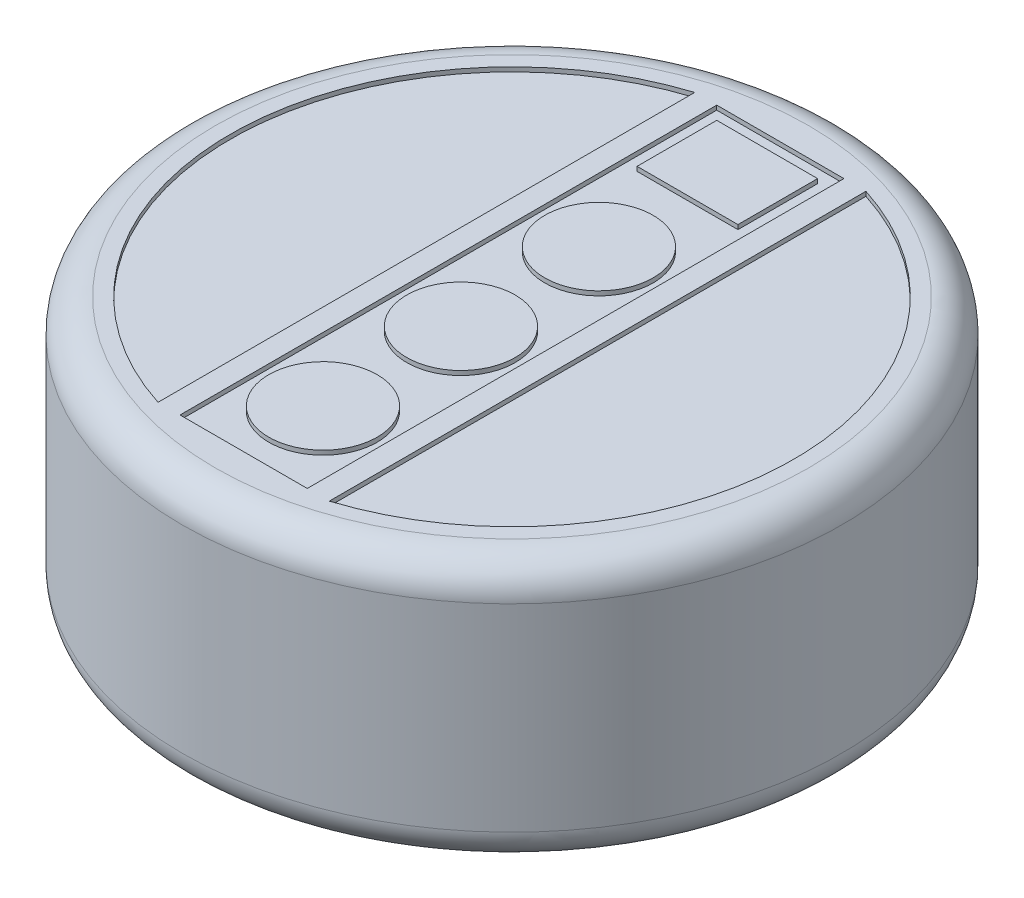
ISO-10303-21;
HEADER;
FILE_DESCRIPTION(('STEP AP214'),'2;1');
FILE_NAME('part.step','',(''),(''),'','','');
FILE_SCHEMA(('AUTOMOTIVE_DESIGN { 1 0 10303 214 1 1 1 1 }'));
ENDSEC;
DATA;
#1=APPLICATION_CONTEXT('core data for automotive mechanical design processes');
#2=APPLICATION_PROTOCOL_DEFINITION('international standard','automotive_design',2000,#1);
#3=PRODUCT_CONTEXT('',#1,'mechanical');
#4=PRODUCT('Part','Part','',(#3));
#5=PRODUCT_RELATED_PRODUCT_CATEGORY('part','',(#4));
#6=PRODUCT_DEFINITION_FORMATION('','',#4);
#7=PRODUCT_DEFINITION_CONTEXT('part definition',#1,'design');
#8=PRODUCT_DEFINITION('design','',#6,#7);
#9=PRODUCT_DEFINITION_SHAPE('','',#8);
#10=(LENGTH_UNIT() NAMED_UNIT(*) SI_UNIT(.MILLI.,.METRE.));
#11=(NAMED_UNIT(*) PLANE_ANGLE_UNIT() SI_UNIT($,.RADIAN.));
#12=(NAMED_UNIT(*) SI_UNIT($,.STERADIAN.) SOLID_ANGLE_UNIT());
#13=UNCERTAINTY_MEASURE_WITH_UNIT(LENGTH_MEASURE(1.E-05),#10,'distance_accuracy_value','');
#14=(GEOMETRIC_REPRESENTATION_CONTEXT(3) GLOBAL_UNCERTAINTY_ASSIGNED_CONTEXT((#13)) GLOBAL_UNIT_ASSIGNED_CONTEXT((#10,
#11,#12)) REPRESENTATION_CONTEXT('',''));
#15=CARTESIAN_POINT('',(0.,0.,0.));
#16=DIRECTION('',(0.,0.,1.));
#17=DIRECTION('',(1.,0.,0.));
#18=AXIS2_PLACEMENT_3D('',#15,#16,#17);
#19=CARTESIAN_POINT('',(0.,149.86,0.));
#20=DIRECTION('',(0.,1.,0.));
#21=DIRECTION('',(0.,0.,1.));
#22=AXIS2_PLACEMENT_3D('',#19,#20,#21);
#23=PLANE('',#22);
#24=CARTESIAN_POINT('',(0.,149.86,109.261686297092));
#25=DIRECTION('',(0.,1.,0.));
#26=DIRECTION('',(0.,0.,-1.));
#27=AXIS2_PLACEMENT_3D('',#24,#25,#26);
#28=CIRCLE('',#27,31.3344729587835);
#29=CARTESIAN_POINT('',(0.,149.86,77.9272133383087));
#30=VERTEX_POINT('',#29);
#31=EDGE_CURVE('E324',#30,#30,#28,.T.);
#32=ORIENTED_EDGE('',*,*,#31,.F.);
#33=EDGE_LOOP('',(#32));
#34=FACE_BOUND('',#33,.T.);
#35=CARTESIAN_POINT('',(0.,149.86,29.5056862970922));
#36=DIRECTION('',(0.,1.,0.));
#37=DIRECTION('',(0.,0.,-1.));
#38=AXIS2_PLACEMENT_3D('',#35,#36,#37);
#39=CIRCLE('',#38,31.3344729587835);
#40=CARTESIAN_POINT('',(0.,149.86,-1.82878666169127));
#41=VERTEX_POINT('',#40);
#42=EDGE_CURVE('E328',#41,#41,#39,.T.);
#43=ORIENTED_EDGE('',*,*,#42,.F.);
#44=EDGE_LOOP('',(#43));
#45=FACE_BOUND('',#44,.T.);
#46=CARTESIAN_POINT('',(0.,149.86,-50.2503137029078));
#47=DIRECTION('',(0.,1.,0.));
#48=DIRECTION('',(0.,0.,1.));
#49=AXIS2_PLACEMENT_3D('',#46,#47,#48);
#50=CIRCLE('',#49,31.3344729587835);
#51=CARTESIAN_POINT('',(0.,149.86,-18.9158407441243));
#52=VERTEX_POINT('',#51);
#53=EDGE_CURVE('E334',#52,#52,#50,.T.);
#54=ORIENTED_EDGE('',*,*,#53,.F.);
#55=EDGE_LOOP('',(#54));
#56=FACE_BOUND('',#55,.T.);
#57=DIRECTION('',(0.,0.,1.));
#58=VECTOR('',#57,1.);
#59=CARTESIAN_POINT('',(-36.7786939679026,149.86,-155.117772231155));
#60=LINE('',#59,#58);
#61=CARTESIAN_POINT('',(-36.7786939679026,149.86,-155.117772231155));
#62=VERTEX_POINT('',#61);
#63=CARTESIAN_POINT('',(-36.7786939679026,149.86,155.117772231155));
#64=VERTEX_POINT('',#63);
#65=EDGE_CURVE('E377',#62,#64,#60,.T.);
#66=ORIENTED_EDGE('',*,*,#65,.T.);
#67=DIRECTION('',(1.,0.,0.));
#68=VECTOR('',#67,1.);
#69=CARTESIAN_POINT('',(-36.7786939679026,149.86,155.117772231155));
#70=LINE('',#69,#68);
#71=CARTESIAN_POINT('',(36.7786939679026,149.86,155.117772231155));
#72=VERTEX_POINT('',#71);
#73=EDGE_CURVE('E380',#64,#72,#70,.T.);
#74=ORIENTED_EDGE('',*,*,#73,.T.);
#75=DIRECTION('',(0.,0.,-1.));
#76=VECTOR('',#75,1.);
#77=CARTESIAN_POINT('',(36.7786939679026,149.86,-155.117772231155));
#78=LINE('',#77,#76);
#79=CARTESIAN_POINT('',(36.7786939679026,149.86,-155.117772231155));
#80=VERTEX_POINT('',#79);
#81=EDGE_CURVE('E384',#72,#80,#78,.T.);
#82=ORIENTED_EDGE('',*,*,#81,.T.);
#83=DIRECTION('',(-1.,0.,0.));
#84=VECTOR('',#83,1.);
#85=CARTESIAN_POINT('',(-36.7786939679026,149.86,-155.117772231155));
#86=LINE('',#85,#84);
#87=EDGE_CURVE('E387',#80,#62,#86,.T.);
#88=ORIENTED_EDGE('',*,*,#87,.T.);
#89=EDGE_LOOP('',(#66,#74,#82,#88));
#90=FACE_BOUND('',#89,.T.);
#91=DIRECTION('',(1.,0.,0.));
#92=VECTOR('',#91,1.);
#93=CARTESIAN_POINT('',(-29.1586939679026,149.86,-101.456311873579));
#94=LINE('',#93,#92);
#95=CARTESIAN_POINT('',(-29.1586939679026,149.86,-101.456311873579));
#96=VERTEX_POINT('',#95);
#97=CARTESIAN_POINT('',(29.1586939679026,149.86,-101.456311873579));
#98=VERTEX_POINT('',#97);
#99=EDGE_CURVE('E309',#96,#98,#94,.T.);
#100=ORIENTED_EDGE('',*,*,#99,.F.);
#101=DIRECTION('',(0.,0.,1.));
#102=VECTOR('',#101,1.);
#103=CARTESIAN_POINT('',(-29.1586939679026,149.86,-147.497772231155));
#104=LINE('',#103,#102);
#105=CARTESIAN_POINT('',(-29.1586939679026,149.86,-147.497772231155));
#106=VERTEX_POINT('',#105);
#107=EDGE_CURVE('E260',#106,#96,#104,.T.);
#108=ORIENTED_EDGE('',*,*,#107,.F.);
#109=DIRECTION('',(-1.,0.,0.));
#110=VECTOR('',#109,1.);
#111=CARTESIAN_POINT('',(-29.1586939679026,149.86,-147.497772231155));
#112=LINE('',#111,#110);
#113=CARTESIAN_POINT('',(29.1586939679026,149.86,-147.497772231155));
#114=VERTEX_POINT('',#113);
#115=EDGE_CURVE('E300',#114,#106,#112,.T.);
#116=ORIENTED_EDGE('',*,*,#115,.F.);
#117=DIRECTION('',(0.,0.,-1.));
#118=VECTOR('',#117,1.);
#119=CARTESIAN_POINT('',(29.1586939679026,149.86,-147.497772231155));
#120=LINE('',#119,#118);
#121=EDGE_CURVE('E311',#98,#114,#120,.T.);
#122=ORIENTED_EDGE('',*,*,#121,.F.);
#123=EDGE_LOOP('',(#100,#108,#116,#122));
#124=FACE_BOUND('',#123,.T.);
#125=ADVANCED_FACE('F34',(#34,#45,#56,#90,#124),#23,.T.);
#126=CARTESIAN_POINT('',(0.,152.4,0.));
#127=DIRECTION('',(0.,-1.,0.));
#128=DIRECTION('',(0.,0.,-1.));
#129=AXIS2_PLACEMENT_3D('',#126,#127,#128);
#130=CYLINDRICAL_SURFACE('',#129,190.5);
#131=CARTESIAN_POINT('',(0.,19.05,0.));
#132=DIRECTION('',(0.,1.,0.));
#133=DIRECTION('',(0.,0.,1.));
#134=AXIS2_PLACEMENT_3D('',#131,#132,#133);
#135=CIRCLE('',#134,190.5);
#136=CARTESIAN_POINT('',(0.,19.05,-190.5));
#137=VERTEX_POINT('',#136);
#138=EDGE_CURVE('E409',#137,#137,#135,.T.);
#139=CARTESIAN_POINT('',(0.,133.35,0.));
#140=DIRECTION('',(0.,1.,0.));
#141=DIRECTION('',(0.,0.,1.));
#142=AXIS2_PLACEMENT_3D('',#139,#140,#141);
#143=CIRCLE('',#142,190.5);
#144=CARTESIAN_POINT('',(0.,133.35,-190.5));
#145=VERTEX_POINT('',#144);
#146=EDGE_CURVE('E358',#145,#145,#143,.F.);
#147=CARTESIAN_POINT('',(0.,19.05,-190.5));
#148=CARTESIAN_POINT('',(0.,20.240625,-190.5));
#149=CARTESIAN_POINT('',(0.,21.43125,-190.5));
#150=CARTESIAN_POINT('',(0.,23.8125,-190.5));
#151=CARTESIAN_POINT('',(0.,25.003125,-190.5));
#152=CARTESIAN_POINT('',(0.,27.384375,-190.5));
#153=CARTESIAN_POINT('',(0.,28.575,-190.5));
#154=CARTESIAN_POINT('',(0.,30.95625,-190.5));
#155=CARTESIAN_POINT('',(0.,32.146875,-190.5));
#156=CARTESIAN_POINT('',(0.,34.528125,-190.5));
#157=CARTESIAN_POINT('',(0.,35.71875,-190.5));
#158=CARTESIAN_POINT('',(0.,38.1,-190.5));
#159=CARTESIAN_POINT('',(0.,39.290625,-190.5));
#160=CARTESIAN_POINT('',(0.,41.671875,-190.5));
#161=CARTESIAN_POINT('',(0.,42.8625,-190.5));
#162=CARTESIAN_POINT('',(0.,45.24375,-190.5));
#163=CARTESIAN_POINT('',(0.,46.434375,-190.5));
#164=CARTESIAN_POINT('',(0.,48.815625,-190.5));
#165=CARTESIAN_POINT('',(0.,50.00625,-190.5));
#166=CARTESIAN_POINT('',(0.,52.3875,-190.5));
#167=CARTESIAN_POINT('',(0.,53.578125,-190.5));
#168=CARTESIAN_POINT('',(0.,55.959375,-190.5));
#169=CARTESIAN_POINT('',(0.,57.15,-190.5));
#170=CARTESIAN_POINT('',(0.,59.53125,-190.5));
#171=CARTESIAN_POINT('',(0.,60.721875,-190.5));
#172=CARTESIAN_POINT('',(0.,63.103125,-190.5));
#173=CARTESIAN_POINT('',(0.,64.29375,-190.5));
#174=CARTESIAN_POINT('',(0.,66.675,-190.5));
#175=CARTESIAN_POINT('',(0.,67.865625,-190.5));
#176=CARTESIAN_POINT('',(0.,70.246875,-190.5));
#177=CARTESIAN_POINT('',(0.,71.4375,-190.5));
#178=CARTESIAN_POINT('',(0.,73.81875,-190.5));
#179=CARTESIAN_POINT('',(0.,75.009375,-190.5));
#180=CARTESIAN_POINT('',(0.,77.390625,-190.5));
#181=CARTESIAN_POINT('',(0.,78.58125,-190.5));
#182=CARTESIAN_POINT('',(0.,80.9625,-190.5));
#183=CARTESIAN_POINT('',(0.,82.153125,-190.5));
#184=CARTESIAN_POINT('',(0.,84.534375,-190.5));
#185=CARTESIAN_POINT('',(0.,85.725,-190.5));
#186=CARTESIAN_POINT('',(0.,88.10625,-190.5));
#187=CARTESIAN_POINT('',(0.,89.296875,-190.5));
#188=CARTESIAN_POINT('',(0.,91.678125,-190.5));
#189=CARTESIAN_POINT('',(0.,92.86875,-190.5));
#190=CARTESIAN_POINT('',(0.,95.25,-190.5));
#191=CARTESIAN_POINT('',(0.,96.440625,-190.5));
#192=CARTESIAN_POINT('',(0.,98.821875,-190.5));
#193=CARTESIAN_POINT('',(0.,100.0125,-190.5));
#194=CARTESIAN_POINT('',(0.,102.39375,-190.5));
#195=CARTESIAN_POINT('',(0.,103.584375,-190.5));
#196=CARTESIAN_POINT('',(0.,105.965625,-190.5));
#197=CARTESIAN_POINT('',(0.,107.15625,-190.5));
#198=CARTESIAN_POINT('',(0.,109.5375,-190.5));
#199=CARTESIAN_POINT('',(0.,110.728125,-190.5));
#200=CARTESIAN_POINT('',(0.,113.109375,-190.5));
#201=CARTESIAN_POINT('',(0.,114.3,-190.5));
#202=CARTESIAN_POINT('',(0.,116.68125,-190.5));
#203=CARTESIAN_POINT('',(0.,117.871875,-190.5));
#204=CARTESIAN_POINT('',(0.,120.253125,-190.5));
#205=CARTESIAN_POINT('',(0.,121.44375,-190.5));
#206=CARTESIAN_POINT('',(0.,123.825,-190.5));
#207=CARTESIAN_POINT('',(0.,125.015625,-190.5));
#208=CARTESIAN_POINT('',(0.,127.396875,-190.5));
#209=CARTESIAN_POINT('',(0.,128.5875,-190.5));
#210=CARTESIAN_POINT('',(0.,130.96875,-190.5));
#211=CARTESIAN_POINT('',(0.,132.159375,-190.5));
#212=CARTESIAN_POINT('',(0.,133.35,-190.5));
#213=B_SPLINE_CURVE_WITH_KNOTS('',3,(#147,#148,#149,#150,#151,#152,#153,#154,#155,#156,#157,
#158,#159,#160,#161,#162,#163,#164,#165,#166,#167,#168,#169,#170,#171,#172,#173,#174,#175,#176,
#177,#178,#179,#180,#181,#182,#183,#184,#185,#186,#187,#188,#189,#190,#191,#192,#193,#194,#195,
#196,#197,#198,#199,#200,#201,#202,#203,#204,#205,#206,#207,#208,#209,#210,#211,#212),
.UNSPECIFIED.,.F.,.F.,(4,2,2,2,2,2,2,2,2,2,2,2,2,2,2,2,2,2,2,2,2,2,2,2,2,2,2,2,2,2,2,2,4),(0.,
3.571875,7.14375,10.715625,14.2875,17.859375,21.43125,25.003125,28.575,32.146875,35.71875,
39.290625,42.8625,46.434375,50.00625,53.578125,57.15,60.721875,64.29375,67.865625,71.4375,
75.009375,78.58125,82.153125,85.725,89.296875,92.86875,96.440625,100.0125,103.584375,107.15625,
110.728125,114.3),.UNSPECIFIED.);
#214=EDGE_CURVE('BSEAM423',#137,#145,#213,.T.);
#215=ORIENTED_EDGE('',*,*,#138,.T.);
#216=ORIENTED_EDGE('',*,*,#146,.T.);
#217=ORIENTED_EDGE('',*,*,#214,.T.);
#218=ORIENTED_EDGE('',*,*,#214,.F.);
#219=EDGE_LOOP('',(#215,#217,#216,#218));
#220=FACE_BOUND('',#219,.T.);
#221=ADVANCED_FACE('F423',(#220),#130,.T.);
#222=CARTESIAN_POINT('',(0.,152.4,0.));
#223=DIRECTION('',(0.,1.,0.));
#224=DIRECTION('',(0.,0.,1.));
#225=AXIS2_PLACEMENT_3D('',#222,#223,#224);
#226=PLANE('',#225);
#227=CARTESIAN_POINT('',(0.,152.4,0.));
#228=DIRECTION('',(0.,1.,0.));
#229=DIRECTION('',(0.,0.,1.));
#230=AXIS2_PLACEMENT_3D('',#227,#228,#229);
#231=CIRCLE('',#230,171.45);
#232=CARTESIAN_POINT('',(0.,152.4,171.45));
#233=VERTEX_POINT('',#232);
#234=EDGE_CURVE('E11',#233,#233,#231,.T.);
#235=ORIENTED_EDGE('',*,*,#234,.T.);
#236=EDGE_LOOP('',(#235));
#237=FACE_BOUND('',#236,.T.);
#238=CARTESIAN_POINT('',(0.,152.4,0.));
#239=DIRECTION('',(0.,1.,0.));
#240=DIRECTION('',(0.,0.,1.));
#241=AXIS2_PLACEMENT_3D('',#238,#239,#240);
#242=CIRCLE('',#241,162.817887281238);
#243=CARTESIAN_POINT('',(-49.4786939679026,152.4,-155.117772231155));
#244=VERTEX_POINT('',#243);
#245=CARTESIAN_POINT('',(-49.4786939679026,152.4,155.117772231155));
#246=VERTEX_POINT('',#245);
#247=EDGE_CURVE('E351',#244,#246,#242,.T.);
#248=ORIENTED_EDGE('',*,*,#247,.F.);
#249=DIRECTION('',(0.,0.,-1.));
#250=VECTOR('',#249,1.);
#251=CARTESIAN_POINT('',(-49.4786939679026,152.4,-155.117772231155));
#252=LINE('',#251,#250);
#253=EDGE_CURVE('E347',#246,#244,#252,.T.);
#254=ORIENTED_EDGE('',*,*,#253,.F.);
#255=EDGE_LOOP('',(#248,#254));
#256=FACE_BOUND('',#255,.T.);
#257=CARTESIAN_POINT('',(0.,152.4,0.));
#258=DIRECTION('',(0.,1.,0.));
#259=DIRECTION('',(0.,0.,-1.));
#260=AXIS2_PLACEMENT_3D('',#257,#258,#259);
#261=CIRCLE('',#260,162.817887281238);
#262=CARTESIAN_POINT('',(49.4786939679026,152.4,155.117772231155));
#263=VERTEX_POINT('',#262);
#264=CARTESIAN_POINT('',(49.4786939679026,152.4,-155.117772231155));
#265=VERTEX_POINT('',#264);
#266=EDGE_CURVE('E369',#263,#265,#261,.T.);
#267=ORIENTED_EDGE('',*,*,#266,.F.);
#268=DIRECTION('',(0.,0.,1.));
#269=VECTOR('',#268,1.);
#270=CARTESIAN_POINT('',(49.4786939679026,152.4,-155.117772231155));
#271=LINE('',#270,#269);
#272=EDGE_CURVE('E365',#265,#263,#271,.T.);
#273=ORIENTED_EDGE('',*,*,#272,.F.);
#274=EDGE_LOOP('',(#267,#273));
#275=FACE_BOUND('',#274,.T.);
#276=DIRECTION('',(0.,0.,1.));
#277=VECTOR('',#276,1.);
#278=CARTESIAN_POINT('',(-36.7786939679026,152.4,-155.117772231155));
#279=LINE('',#278,#277);
#280=CARTESIAN_POINT('',(-36.7786939679026,152.4,-155.117772231155));
#281=VERTEX_POINT('',#280);
#282=CARTESIAN_POINT('',(-36.7786939679026,152.4,155.117772231155));
#283=VERTEX_POINT('',#282);
#284=EDGE_CURVE('E340',#281,#283,#279,.T.);
#285=ORIENTED_EDGE('',*,*,#284,.F.);
#286=DIRECTION('',(-1.,0.,0.));
#287=VECTOR('',#286,1.);
#288=CARTESIAN_POINT('',(-36.7786939679026,152.4,-155.117772231155));
#289=LINE('',#288,#287);
#290=CARTESIAN_POINT('',(36.7786939679026,152.4,-155.117772231155));
#291=VERTEX_POINT('',#290);
#292=EDGE_CURVE('E381',#291,#281,#289,.T.);
#293=ORIENTED_EDGE('',*,*,#292,.F.);
#294=DIRECTION('',(0.,0.,-1.));
#295=VECTOR('',#294,1.);
#296=CARTESIAN_POINT('',(36.7786939679026,152.4,-155.117772231155));
#297=LINE('',#296,#295);
#298=CARTESIAN_POINT('',(36.7786939679026,152.4,155.117772231155));
#299=VERTEX_POINT('',#298);
#300=EDGE_CURVE('E395',#299,#291,#297,.T.);
#301=ORIENTED_EDGE('',*,*,#300,.F.);
#302=DIRECTION('',(1.,0.,0.));
#303=VECTOR('',#302,1.);
#304=CARTESIAN_POINT('',(-36.7786939679026,152.4,155.117772231155));
#305=LINE('',#304,#303);
#306=EDGE_CURVE('E392',#283,#299,#305,.T.);
#307=ORIENTED_EDGE('',*,*,#306,.F.);
#308=EDGE_LOOP('',(#285,#293,#301,#307));
#309=FACE_BOUND('',#308,.T.);
#310=ADVANCED_FACE('F426',(#237,#256,#275,#309),#226,.T.);
#311=CARTESIAN_POINT('',(0.,0.,0.));
#312=DIRECTION('',(0.,1.,0.));
#313=DIRECTION('',(0.,0.,1.));
#314=AXIS2_PLACEMENT_3D('',#311,#312,#313);
#315=PLANE('',#314);
#316=DIRECTION('',(-1.,0.,0.));
#317=VECTOR('',#316,1.);
#318=CARTESIAN_POINT('',(-96.0756501182034,0.,104.944171667576));
#319=LINE('',#318,#317);
#320=CARTESIAN_POINT('',(96.0756501182034,0.,104.944171667576));
#321=VERTEX_POINT('',#320);
#322=CARTESIAN_POINT('',(-96.0756501182034,0.,104.944171667576));
#323=VERTEX_POINT('',#322);
#324=EDGE_CURVE('E224',#321,#323,#319,.T.);
#325=ORIENTED_EDGE('',*,*,#324,.F.);
#326=DIRECTION('',(0.,0.,1.));
#327=VECTOR('',#326,1.);
#328=CARTESIAN_POINT('',(96.0756501182034,0.,70.4554767533447));
#329=LINE('',#328,#327);
#330=CARTESIAN_POINT('',(96.0756501182034,0.,70.4554767533447));
#331=VERTEX_POINT('',#330);
#332=EDGE_CURVE('E49',#331,#321,#329,.T.);
#333=ORIENTED_EDGE('',*,*,#332,.F.);
#334=DIRECTION('',(1.,0.,0.));
#335=VECTOR('',#334,1.);
#336=CARTESIAN_POINT('',(-96.0756501182034,0.,70.4554767533447));
#337=LINE('',#336,#335);
#338=CARTESIAN_POINT('',(-96.0756501182034,0.,70.4554767533447));
#339=VERTEX_POINT('',#338);
#340=EDGE_CURVE('E215',#339,#331,#337,.T.);
#341=ORIENTED_EDGE('',*,*,#340,.F.);
#342=DIRECTION('',(0.,0.,-1.));
#343=VECTOR('',#342,1.);
#344=CARTESIAN_POINT('',(-96.0756501182034,0.,70.4554767533447));
#345=LINE('',#344,#343);
#346=EDGE_CURVE('E218',#323,#339,#345,.T.);
#347=ORIENTED_EDGE('',*,*,#346,.F.);
#348=EDGE_LOOP('',(#325,#333,#341,#347));
#349=FACE_BOUND('',#348,.T.);
#350=CARTESIAN_POINT('',(0.,0.,0.));
#351=DIRECTION('',(0.,1.,0.));
#352=DIRECTION('',(0.,0.,1.));
#353=AXIS2_PLACEMENT_3D('',#350,#351,#352);
#354=CIRCLE('',#353,171.45);
#355=CARTESIAN_POINT('',(0.,0.,171.45));
#356=VERTEX_POINT('',#355);
#357=EDGE_CURVE('E42',#356,#356,#354,.F.);
#358=ORIENTED_EDGE('',*,*,#357,.T.);
#359=EDGE_LOOP('',(#358));
#360=FACE_BOUND('',#359,.T.);
#361=DIRECTION('',(1.,0.,0.));
#362=VECTOR('',#361,1.);
#363=CARTESIAN_POINT('',(-166.428334255672,0.,-29.014849658734));
#364=LINE('',#363,#362);
#365=CARTESIAN_POINT('',(-166.428334255672,0.,-29.014849658734));
#366=VERTEX_POINT('',#365);
#367=CARTESIAN_POINT('',(-141.028334255672,0.,-29.014849658734));
#368=VERTEX_POINT('',#367);
#369=EDGE_CURVE('E249',#366,#368,#364,.T.);
#370=ORIENTED_EDGE('',*,*,#369,.F.);
#371=DIRECTION('',(0.,0.,-1.));
#372=VECTOR('',#371,1.);
#373=CARTESIAN_POINT('',(-166.428334255672,0.,34.485150341266));
#374=LINE('',#373,#372);
#375=CARTESIAN_POINT('',(-166.428334255672,0.,34.485150341266));
#376=VERTEX_POINT('',#375);
#377=EDGE_CURVE('E57',#376,#366,#374,.T.);
#378=ORIENTED_EDGE('',*,*,#377,.F.);
#379=DIRECTION('',(-1.,0.,0.));
#380=VECTOR('',#379,1.);
#381=CARTESIAN_POINT('',(-166.428334255672,0.,34.485150341266));
#382=LINE('',#381,#380);
#383=CARTESIAN_POINT('',(-141.028334255672,0.,34.485150341266));
#384=VERTEX_POINT('',#383);
#385=EDGE_CURVE('E238',#384,#376,#382,.T.);
#386=ORIENTED_EDGE('',*,*,#385,.F.);
#387=DIRECTION('',(0.,0.,1.));
#388=VECTOR('',#387,1.);
#389=CARTESIAN_POINT('',(-141.028334255672,0.,34.485150341266));
#390=LINE('',#389,#388);
#391=EDGE_CURVE('E253',#368,#384,#390,.T.);
#392=ORIENTED_EDGE('',*,*,#391,.F.);
#393=EDGE_LOOP('',(#370,#378,#386,#392));
#394=FACE_BOUND('',#393,.T.);
#395=DIRECTION('',(1.,0.,0.));
#396=VECTOR('',#395,1.);
#397=CARTESIAN_POINT('',(139.439955727726,0.,-29.4873024657192));
#398=LINE('',#397,#396);
#399=CARTESIAN_POINT('',(139.439955727726,0.,-29.4873024657192));
#400=VERTEX_POINT('',#399);
#401=CARTESIAN_POINT('',(164.839955727726,0.,-29.4873024657192));
#402=VERTEX_POINT('',#401);
#403=EDGE_CURVE('E281',#400,#402,#398,.T.);
#404=ORIENTED_EDGE('',*,*,#403,.F.);
#405=DIRECTION('',(0.,0.,-1.));
#406=VECTOR('',#405,1.);
#407=CARTESIAN_POINT('',(139.439955727726,0.,34.0126975342808));
#408=LINE('',#407,#406);
#409=CARTESIAN_POINT('',(139.439955727726,0.,34.0126975342808));
#410=VERTEX_POINT('',#409);
#411=EDGE_CURVE('E230',#410,#400,#408,.T.);
#412=ORIENTED_EDGE('',*,*,#411,.F.);
#413=DIRECTION('',(-1.,0.,0.));
#414=VECTOR('',#413,1.);
#415=CARTESIAN_POINT('',(139.439955727726,0.,34.0126975342808));
#416=LINE('',#415,#414);
#417=CARTESIAN_POINT('',(164.839955727726,0.,34.0126975342808));
#418=VERTEX_POINT('',#417);
#419=EDGE_CURVE('E270',#418,#410,#416,.T.);
#420=ORIENTED_EDGE('',*,*,#419,.F.);
#421=DIRECTION('',(0.,0.,1.));
#422=VECTOR('',#421,1.);
#423=CARTESIAN_POINT('',(164.839955727726,0.,34.0126975342808));
#424=LINE('',#423,#422);
#425=EDGE_CURVE('E284',#402,#418,#424,.T.);
#426=ORIENTED_EDGE('',*,*,#425,.F.);
#427=EDGE_LOOP('',(#404,#412,#420,#426));
#428=FACE_BOUND('',#427,.T.);
#429=ADVANCED_FACE('F414',(#349,#360,#394,#428),#315,.F.);
#430=CARTESIAN_POINT('',(-36.7786939679026,149.86,-155.117772231155));
#431=DIRECTION('',(-1.,0.,0.));
#432=DIRECTION('',(0.,0.,1.));
#433=AXIS2_PLACEMENT_3D('',#430,#431,#432);
#434=PLANE('',#433);
#435=ORIENTED_EDGE('',*,*,#284,.T.);
#436=DIRECTION('',(0.,1.,0.));
#437=VECTOR('',#436,1.);
#438=CARTESIAN_POINT('',(-36.7786939679026,149.86,155.117772231155));
#439=LINE('',#438,#437);
#440=EDGE_CURVE('E390',#64,#283,#439,.T.);
#441=ORIENTED_EDGE('',*,*,#440,.F.);
#442=ORIENTED_EDGE('',*,*,#65,.F.);
#443=DIRECTION('',(0.,1.,0.));
#444=VECTOR('',#443,1.);
#445=CARTESIAN_POINT('',(-36.7786939679026,149.86,-155.117772231155));
#446=LINE('',#445,#444);
#447=EDGE_CURVE('E371',#62,#281,#446,.T.);
#448=ORIENTED_EDGE('',*,*,#447,.T.);
#449=EDGE_LOOP('',(#435,#441,#442,#448));
#450=FACE_BOUND('',#449,.T.);
#451=ADVANCED_FACE('F448',(#450),#434,.F.);
#452=CARTESIAN_POINT('',(-36.7786939679026,149.86,-155.117772231155));
#453=DIRECTION('',(0.,0.,-1.));
#454=DIRECTION('',(-1.,0.,0.));
#455=AXIS2_PLACEMENT_3D('',#452,#453,#454);
#456=PLANE('',#455);
#457=ORIENTED_EDGE('',*,*,#292,.T.);
#458=ORIENTED_EDGE('',*,*,#447,.F.);
#459=ORIENTED_EDGE('',*,*,#87,.F.);
#460=DIRECTION('',(0.,1.,0.));
#461=VECTOR('',#460,1.);
#462=CARTESIAN_POINT('',(36.7786939679026,149.86,-155.117772231155));
#463=LINE('',#462,#461);
#464=EDGE_CURVE('E401',#80,#291,#463,.T.);
#465=ORIENTED_EDGE('',*,*,#464,.T.);
#466=EDGE_LOOP('',(#457,#458,#459,#465));
#467=FACE_BOUND('',#466,.T.);
#468=ADVANCED_FACE('F458',(#467),#456,.F.);
#469=CARTESIAN_POINT('',(36.7786939679026,149.86,-155.117772231155));
#470=DIRECTION('',(1.,0.,0.));
#471=DIRECTION('',(0.,0.,-1.));
#472=AXIS2_PLACEMENT_3D('',#469,#470,#471);
#473=PLANE('',#472);
#474=ORIENTED_EDGE('',*,*,#300,.T.);
#475=ORIENTED_EDGE('',*,*,#464,.F.);
#476=ORIENTED_EDGE('',*,*,#81,.F.);
#477=DIRECTION('',(0.,1.,0.));
#478=VECTOR('',#477,1.);
#479=CARTESIAN_POINT('',(36.7786939679026,149.86,155.117772231155));
#480=LINE('',#479,#478);
#481=EDGE_CURVE('E403',#72,#299,#480,.T.);
#482=ORIENTED_EDGE('',*,*,#481,.T.);
#483=EDGE_LOOP('',(#474,#475,#476,#482));
#484=FACE_BOUND('',#483,.T.);
#485=ADVANCED_FACE('F460',(#484),#473,.F.);
#486=CARTESIAN_POINT('',(-36.7786939679026,149.86,155.117772231155));
#487=DIRECTION('',(0.,0.,1.));
#488=DIRECTION('',(1.,0.,0.));
#489=AXIS2_PLACEMENT_3D('',#486,#487,#488);
#490=PLANE('',#489);
#491=ORIENTED_EDGE('',*,*,#306,.T.);
#492=ORIENTED_EDGE('',*,*,#481,.F.);
#493=ORIENTED_EDGE('',*,*,#73,.F.);
#494=ORIENTED_EDGE('',*,*,#440,.T.);
#495=EDGE_LOOP('',(#491,#492,#493,#494));
#496=FACE_BOUND('',#495,.T.);
#497=ADVANCED_FACE('F452',(#496),#490,.F.);
#498=CARTESIAN_POINT('',(0.,149.86,0.));
#499=DIRECTION('',(0.,1.,0.));
#500=DIRECTION('',(0.,0.,1.));
#501=AXIS2_PLACEMENT_3D('',#498,#499,#500);
#502=CYLINDRICAL_SURFACE('',#501,162.817887281238);
#503=ORIENTED_EDGE('',*,*,#266,.T.);
#504=DIRECTION('',(0.,1.,0.));
#505=VECTOR('',#504,1.);
#506=CARTESIAN_POINT('',(49.4786939679026,149.86,-155.117772231155));
#507=LINE('',#506,#505);
#508=CARTESIAN_POINT('',(49.4786939679026,149.86,-155.117772231155));
#509=VERTEX_POINT('',#508);
#510=EDGE_CURVE('E368',#509,#265,#507,.T.);
#511=ORIENTED_EDGE('',*,*,#510,.F.);
#512=CARTESIAN_POINT('',(0.,149.86,0.));
#513=DIRECTION('',(0.,1.,0.));
#514=DIRECTION('',(0.,0.,-1.));
#515=AXIS2_PLACEMENT_3D('',#512,#513,#514);
#516=CIRCLE('',#515,162.817887281238);
#517=CARTESIAN_POINT('',(49.4786939679026,149.86,155.117772231155));
#518=VERTEX_POINT('',#517);
#519=EDGE_CURVE('E361',#518,#509,#516,.T.);
#520=ORIENTED_EDGE('',*,*,#519,.F.);
#521=DIRECTION('',(0.,1.,0.));
#522=VECTOR('',#521,1.);
#523=CARTESIAN_POINT('',(49.4786939679026,149.86,155.117772231155));
#524=LINE('',#523,#522);
#525=EDGE_CURVE('E353',#518,#263,#524,.T.);
#526=ORIENTED_EDGE('',*,*,#525,.T.);
#527=EDGE_LOOP('',(#503,#511,#520,#526));
#528=FACE_BOUND('',#527,.T.);
#529=ADVANCED_FACE('F467',(#528),#502,.F.);
#530=CARTESIAN_POINT('',(49.4786939679026,149.86,-155.117772231155));
#531=DIRECTION('',(-1.,0.,0.));
#532=DIRECTION('',(0.,0.,1.));
#533=AXIS2_PLACEMENT_3D('',#530,#531,#532);
#534=PLANE('',#533);
#535=ORIENTED_EDGE('',*,*,#272,.T.);
#536=ORIENTED_EDGE('',*,*,#525,.F.);
#537=DIRECTION('',(0.,0.,1.));
#538=VECTOR('',#537,1.);
#539=CARTESIAN_POINT('',(49.4786939679026,149.86,-155.117772231155));
#540=LINE('',#539,#538);
#541=EDGE_CURVE('E364',#509,#518,#540,.T.);
#542=ORIENTED_EDGE('',*,*,#541,.F.);
#543=ORIENTED_EDGE('',*,*,#510,.T.);
#544=EDGE_LOOP('',(#535,#536,#542,#543));
#545=FACE_BOUND('',#544,.T.);
#546=ADVANCED_FACE('F480',(#545),#534,.F.);
#547=CARTESIAN_POINT('',(0.,149.86,0.));
#548=DIRECTION('',(0.,-1.,0.));
#549=DIRECTION('',(0.,0.,-1.));
#550=AXIS2_PLACEMENT_3D('',#547,#548,#549);
#551=PLANE('',#550);
#552=ORIENTED_EDGE('',*,*,#519,.T.);
#553=ORIENTED_EDGE('',*,*,#541,.T.);
#554=EDGE_LOOP('',(#552,#553));
#555=FACE_BOUND('',#554,.T.);
#556=ADVANCED_FACE('F484',(#555),#551,.F.);
#557=CARTESIAN_POINT('',(0.,149.86,0.));
#558=DIRECTION('',(0.,1.,0.));
#559=DIRECTION('',(0.,0.,1.));
#560=AXIS2_PLACEMENT_3D('',#557,#558,#559);
#561=CYLINDRICAL_SURFACE('',#560,162.817887281238);
#562=ORIENTED_EDGE('',*,*,#247,.T.);
#563=DIRECTION('',(0.,1.,0.));
#564=VECTOR('',#563,1.);
#565=CARTESIAN_POINT('',(-49.4786939679026,149.86,155.117772231155));
#566=LINE('',#565,#564);
#567=CARTESIAN_POINT('',(-49.4786939679026,149.86,155.117772231155));
#568=VERTEX_POINT('',#567);
#569=EDGE_CURVE('E350',#568,#246,#566,.T.);
#570=ORIENTED_EDGE('',*,*,#569,.F.);
#571=CARTESIAN_POINT('',(0.,149.86,0.));
#572=DIRECTION('',(0.,1.,0.));
#573=DIRECTION('',(0.,0.,1.));
#574=AXIS2_PLACEMENT_3D('',#571,#572,#573);
#575=CIRCLE('',#574,162.817887281238);
#576=CARTESIAN_POINT('',(-49.4786939679026,149.86,-155.117772231155));
#577=VERTEX_POINT('',#576);
#578=EDGE_CURVE('E343',#577,#568,#575,.T.);
#579=ORIENTED_EDGE('',*,*,#578,.F.);
#580=DIRECTION('',(0.,1.,0.));
#581=VECTOR('',#580,1.);
#582=CARTESIAN_POINT('',(-49.4786939679026,149.86,-155.117772231155));
#583=LINE('',#582,#581);
#584=EDGE_CURVE('E356',#577,#244,#583,.T.);
#585=ORIENTED_EDGE('',*,*,#584,.T.);
#586=EDGE_LOOP('',(#562,#570,#579,#585));
#587=FACE_BOUND('',#586,.T.);
#588=ADVANCED_FACE('F488',(#587),#561,.F.);
#589=CARTESIAN_POINT('',(-49.4786939679026,149.86,-155.117772231155));
#590=DIRECTION('',(1.,0.,0.));
#591=DIRECTION('',(0.,0.,-1.));
#592=AXIS2_PLACEMENT_3D('',#589,#590,#591);
#593=PLANE('',#592);
#594=ORIENTED_EDGE('',*,*,#253,.T.);
#595=ORIENTED_EDGE('',*,*,#584,.F.);
#596=DIRECTION('',(0.,0.,-1.));
#597=VECTOR('',#596,1.);
#598=CARTESIAN_POINT('',(-49.4786939679026,149.86,-155.117772231155));
#599=LINE('',#598,#597);
#600=EDGE_CURVE('E346',#568,#577,#599,.T.);
#601=ORIENTED_EDGE('',*,*,#600,.F.);
#602=ORIENTED_EDGE('',*,*,#569,.T.);
#603=EDGE_LOOP('',(#594,#595,#601,#602));
#604=FACE_BOUND('',#603,.T.);
#605=ADVANCED_FACE('F492',(#604),#593,.F.);
#606=CARTESIAN_POINT('',(0.,149.86,0.));
#607=DIRECTION('',(0.,1.,0.));
#608=DIRECTION('',(0.,0.,1.));
#609=AXIS2_PLACEMENT_3D('',#606,#607,#608);
#610=PLANE('',#609);
#611=ORIENTED_EDGE('',*,*,#578,.T.);
#612=ORIENTED_EDGE('',*,*,#600,.T.);
#613=EDGE_LOOP('',(#611,#612));
#614=FACE_BOUND('',#613,.T.);
#615=ADVANCED_FACE('F496',(#614),#610,.T.);
#616=CARTESIAN_POINT('',(0.,152.4,-50.2503137029078));
#617=DIRECTION('',(0.,-1.,0.));
#618=DIRECTION('',(0.,0.,-1.));
#619=AXIS2_PLACEMENT_3D('',#616,#617,#618);
#620=CYLINDRICAL_SURFACE('',#619,31.3344729587835);
#621=CARTESIAN_POINT('',(0.,152.4,-50.2503137029078));
#622=DIRECTION('',(0.,1.,0.));
#623=DIRECTION('',(0.,0.,1.));
#624=AXIS2_PLACEMENT_3D('',#621,#622,#623);
#625=CIRCLE('',#624,31.3344729587835);
#626=CARTESIAN_POINT('',(0.,152.4,-18.9158407441243));
#627=VERTEX_POINT('',#626);
#628=EDGE_CURVE('E337',#627,#627,#625,.T.);
#629=ORIENTED_EDGE('',*,*,#628,.F.);
#630=EDGE_LOOP('',(#629));
#631=FACE_BOUND('',#630,.T.);
#632=ORIENTED_EDGE('',*,*,#53,.T.);
#633=EDGE_LOOP('',(#632));
#634=FACE_BOUND('',#633,.T.);
#635=ADVANCED_FACE('F500',(#631,#634),#620,.T.);
#636=CARTESIAN_POINT('',(0.,152.4,-50.2503137029078));
#637=DIRECTION('',(0.,1.,0.));
#638=DIRECTION('',(0.,0.,1.));
#639=AXIS2_PLACEMENT_3D('',#636,#637,#638);
#640=PLANE('',#639);
#641=ORIENTED_EDGE('',*,*,#628,.T.);
#642=EDGE_LOOP('',(#641));
#643=FACE_BOUND('',#642,.T.);
#644=ADVANCED_FACE('F504',(#643),#640,.T.);
#645=CARTESIAN_POINT('',(0.,152.4,29.5056862970922));
#646=DIRECTION('',(0.,-1.,0.));
#647=DIRECTION('',(0.,0.,-1.));
#648=AXIS2_PLACEMENT_3D('',#645,#646,#647);
#649=CYLINDRICAL_SURFACE('',#648,31.3344729587835);
#650=CARTESIAN_POINT('',(0.,152.4,29.5056862970922));
#651=DIRECTION('',(0.,1.,0.));
#652=DIRECTION('',(0.,0.,-1.));
#653=AXIS2_PLACEMENT_3D('',#650,#651,#652);
#654=CIRCLE('',#653,31.3344729587835);
#655=CARTESIAN_POINT('',(0.,152.4,-1.82878666169127));
#656=VERTEX_POINT('',#655);
#657=EDGE_CURVE('E331',#656,#656,#654,.T.);
#658=ORIENTED_EDGE('',*,*,#657,.F.);
#659=EDGE_LOOP('',(#658));
#660=FACE_BOUND('',#659,.T.);
#661=ORIENTED_EDGE('',*,*,#42,.T.);
#662=EDGE_LOOP('',(#661));
#663=FACE_BOUND('',#662,.T.);
#664=ADVANCED_FACE('F508',(#660,#663),#649,.T.);
#665=CARTESIAN_POINT('',(0.,152.4,29.5056862970922));
#666=DIRECTION('',(0.,-1.,0.));
#667=DIRECTION('',(0.,0.,-1.));
#668=AXIS2_PLACEMENT_3D('',#665,#666,#667);
#669=PLANE('',#668);
#670=ORIENTED_EDGE('',*,*,#657,.T.);
#671=EDGE_LOOP('',(#670));
#672=FACE_BOUND('',#671,.T.);
#673=ADVANCED_FACE('F512',(#672),#669,.F.);
#674=CARTESIAN_POINT('',(0.,152.4,109.261686297092));
#675=DIRECTION('',(0.,-1.,0.));
#676=DIRECTION('',(0.,0.,-1.));
#677=AXIS2_PLACEMENT_3D('',#674,#675,#676);
#678=CYLINDRICAL_SURFACE('',#677,31.3344729587835);
#679=CARTESIAN_POINT('',(0.,152.4,109.261686297092));
#680=DIRECTION('',(0.,1.,0.));
#681=DIRECTION('',(0.,0.,-1.));
#682=AXIS2_PLACEMENT_3D('',#679,#680,#681);
#683=CIRCLE('',#682,31.3344729587835);
#684=CARTESIAN_POINT('',(0.,152.4,77.9272133383087));
#685=VERTEX_POINT('',#684);
#686=EDGE_CURVE('E325',#685,#685,#683,.T.);
#687=ORIENTED_EDGE('',*,*,#686,.F.);
#688=EDGE_LOOP('',(#687));
#689=FACE_BOUND('',#688,.T.);
#690=ORIENTED_EDGE('',*,*,#31,.T.);
#691=EDGE_LOOP('',(#690));
#692=FACE_BOUND('',#691,.T.);
#693=ADVANCED_FACE('F516',(#689,#692),#678,.T.);
#694=CARTESIAN_POINT('',(0.,152.4,109.261686297092));
#695=DIRECTION('',(0.,-1.,0.));
#696=DIRECTION('',(0.,0.,-1.));
#697=AXIS2_PLACEMENT_3D('',#694,#695,#696);
#698=PLANE('',#697);
#699=ORIENTED_EDGE('',*,*,#686,.T.);
#700=EDGE_LOOP('',(#699));
#701=FACE_BOUND('',#700,.T.);
#702=ADVANCED_FACE('F520',(#701),#698,.F.);
#703=CARTESIAN_POINT('',(-29.1586939679026,152.4,-147.497772231155));
#704=DIRECTION('',(1.,0.,0.));
#705=DIRECTION('',(0.,0.,-1.));
#706=AXIS2_PLACEMENT_3D('',#703,#704,#705);
#707=PLANE('',#706);
#708=ORIENTED_EDGE('',*,*,#107,.T.);
#709=DIRECTION('',(0.,-1.,0.));
#710=VECTOR('',#709,1.);
#711=CARTESIAN_POINT('',(-29.1586939679026,152.4,-101.456311873579));
#712=LINE('',#711,#710);
#713=CARTESIAN_POINT('',(-29.1586939679026,152.4,-101.456311873579));
#714=VERTEX_POINT('',#713);
#715=EDGE_CURVE('E322',#714,#96,#712,.T.);
#716=ORIENTED_EDGE('',*,*,#715,.F.);
#717=DIRECTION('',(0.,0.,1.));
#718=VECTOR('',#717,1.);
#719=CARTESIAN_POINT('',(-29.1586939679026,152.4,-147.497772231155));
#720=LINE('',#719,#718);
#721=CARTESIAN_POINT('',(-29.1586939679026,152.4,-147.497772231155));
#722=VERTEX_POINT('',#721);
#723=EDGE_CURVE('E296',#722,#714,#720,.T.);
#724=ORIENTED_EDGE('',*,*,#723,.F.);
#725=DIRECTION('',(0.,-1.,0.));
#726=VECTOR('',#725,1.);
#727=CARTESIAN_POINT('',(-29.1586939679026,152.4,-147.497772231155));
#728=LINE('',#727,#726);
#729=EDGE_CURVE('E306',#722,#106,#728,.T.);
#730=ORIENTED_EDGE('',*,*,#729,.T.);
#731=EDGE_LOOP('',(#708,#716,#724,#730));
#732=FACE_BOUND('',#731,.T.);
#733=ADVANCED_FACE('F524',(#732),#707,.F.);
#734=CARTESIAN_POINT('',(-29.1586939679026,152.4,-101.456311873579));
#735=DIRECTION('',(0.,0.,-1.));
#736=DIRECTION('',(-1.,0.,0.));
#737=AXIS2_PLACEMENT_3D('',#734,#735,#736);
#738=PLANE('',#737);
#739=ORIENTED_EDGE('',*,*,#99,.T.);
#740=DIRECTION('',(0.,-1.,0.));
#741=VECTOR('',#740,1.);
#742=CARTESIAN_POINT('',(29.1586939679026,152.4,-101.456311873579));
#743=LINE('',#742,#741);
#744=CARTESIAN_POINT('',(29.1586939679026,152.4,-101.456311873579));
#745=VERTEX_POINT('',#744);
#746=EDGE_CURVE('E319',#745,#98,#743,.T.);
#747=ORIENTED_EDGE('',*,*,#746,.F.);
#748=DIRECTION('',(1.,0.,0.));
#749=VECTOR('',#748,1.);
#750=CARTESIAN_POINT('',(-29.1586939679026,152.4,-101.456311873579));
#751=LINE('',#750,#749);
#752=EDGE_CURVE('E299',#714,#745,#751,.T.);
#753=ORIENTED_EDGE('',*,*,#752,.F.);
#754=ORIENTED_EDGE('',*,*,#715,.T.);
#755=EDGE_LOOP('',(#739,#747,#753,#754));
#756=FACE_BOUND('',#755,.T.);
#757=ADVANCED_FACE('F528',(#756),#738,.F.);
#758=CARTESIAN_POINT('',(29.1586939679026,152.4,-147.497772231155));
#759=DIRECTION('',(-1.,0.,0.));
#760=DIRECTION('',(0.,0.,1.));
#761=AXIS2_PLACEMENT_3D('',#758,#759,#760);
#762=PLANE('',#761);
#763=ORIENTED_EDGE('',*,*,#121,.T.);
#764=DIRECTION('',(0.,-1.,0.));
#765=VECTOR('',#764,1.);
#766=CARTESIAN_POINT('',(29.1586939679026,152.4,-147.497772231155));
#767=LINE('',#766,#765);
#768=CARTESIAN_POINT('',(29.1586939679026,152.4,-147.497772231155));
#769=VERTEX_POINT('',#768);
#770=EDGE_CURVE('E317',#769,#114,#767,.T.);
#771=ORIENTED_EDGE('',*,*,#770,.F.);
#772=DIRECTION('',(0.,0.,-1.));
#773=VECTOR('',#772,1.);
#774=CARTESIAN_POINT('',(29.1586939679026,152.4,-147.497772231155));
#775=LINE('',#774,#773);
#776=EDGE_CURVE('E302',#745,#769,#775,.T.);
#777=ORIENTED_EDGE('',*,*,#776,.F.);
#778=ORIENTED_EDGE('',*,*,#746,.T.);
#779=EDGE_LOOP('',(#763,#771,#777,#778));
#780=FACE_BOUND('',#779,.T.);
#781=ADVANCED_FACE('F532',(#780),#762,.F.);
#782=CARTESIAN_POINT('',(-29.1586939679026,152.4,-147.497772231155));
#783=DIRECTION('',(0.,0.,1.));
#784=DIRECTION('',(1.,0.,0.));
#785=AXIS2_PLACEMENT_3D('',#782,#783,#784);
#786=PLANE('',#785);
#787=ORIENTED_EDGE('',*,*,#115,.T.);
#788=ORIENTED_EDGE('',*,*,#729,.F.);
#789=DIRECTION('',(-1.,0.,0.));
#790=VECTOR('',#789,1.);
#791=CARTESIAN_POINT('',(-29.1586939679026,152.4,-147.497772231155));
#792=LINE('',#791,#790);
#793=EDGE_CURVE('E304',#769,#722,#792,.T.);
#794=ORIENTED_EDGE('',*,*,#793,.F.);
#795=ORIENTED_EDGE('',*,*,#770,.T.);
#796=EDGE_LOOP('',(#787,#788,#794,#795));
#797=FACE_BOUND('',#796,.T.);
#798=ADVANCED_FACE('F536',(#797),#786,.F.);
#799=CARTESIAN_POINT('',(0.,152.4,0.));
#800=DIRECTION('',(0.,1.,0.));
#801=DIRECTION('',(0.,0.,1.));
#802=AXIS2_PLACEMENT_3D('',#799,#800,#801);
#803=PLANE('',#802);
#804=ORIENTED_EDGE('',*,*,#723,.T.);
#805=ORIENTED_EDGE('',*,*,#752,.T.);
#806=ORIENTED_EDGE('',*,*,#776,.T.);
#807=ORIENTED_EDGE('',*,*,#793,.T.);
#808=EDGE_LOOP('',(#804,#805,#806,#807));
#809=FACE_BOUND('',#808,.T.);
#810=ADVANCED_FACE('F540',(#809),#803,.T.);
#811=CARTESIAN_POINT('',(139.439955727726,38.1,34.0126975342808));
#812=DIRECTION('',(-1.,0.,0.));
#813=DIRECTION('',(0.,0.,1.));
#814=AXIS2_PLACEMENT_3D('',#811,#812,#813);
#815=PLANE('',#814);
#816=ORIENTED_EDGE('',*,*,#411,.T.);
#817=DIRECTION('',(0.,-1.,0.));
#818=VECTOR('',#817,1.);
#819=CARTESIAN_POINT('',(139.439955727726,38.1,-29.4873024657192));
#820=LINE('',#819,#818);
#821=CARTESIAN_POINT('',(139.439955727726,38.1,-29.4873024657192));
#822=VERTEX_POINT('',#821);
#823=EDGE_CURVE('E279',#822,#400,#820,.T.);
#824=ORIENTED_EDGE('',*,*,#823,.F.);
#825=DIRECTION('',(0.,0.,-1.));
#826=VECTOR('',#825,1.);
#827=CARTESIAN_POINT('',(139.439955727726,38.1,34.0126975342808));
#828=LINE('',#827,#826);
#829=CARTESIAN_POINT('',(139.439955727726,38.1,34.0126975342808));
#830=VERTEX_POINT('',#829);
#831=EDGE_CURVE('E266',#830,#822,#828,.T.);
#832=ORIENTED_EDGE('',*,*,#831,.F.);
#833=DIRECTION('',(0.,-1.,0.));
#834=VECTOR('',#833,1.);
#835=CARTESIAN_POINT('',(139.439955727726,38.1,34.0126975342808));
#836=LINE('',#835,#834);
#837=EDGE_CURVE('E250',#830,#410,#836,.T.);
#838=ORIENTED_EDGE('',*,*,#837,.T.);
#839=EDGE_LOOP('',(#816,#824,#832,#838));
#840=FACE_BOUND('',#839,.T.);
#841=ADVANCED_FACE('F544',(#840),#815,.F.);
#842=CARTESIAN_POINT('',(139.439955727726,38.1,34.0126975342808));
#843=DIRECTION('',(0.,0.,1.));
#844=DIRECTION('',(1.,0.,0.));
#845=AXIS2_PLACEMENT_3D('',#842,#843,#844);
#846=PLANE('',#845);
#847=ORIENTED_EDGE('',*,*,#419,.T.);
#848=ORIENTED_EDGE('',*,*,#837,.F.);
#849=DIRECTION('',(-1.,0.,0.));
#850=VECTOR('',#849,1.);
#851=CARTESIAN_POINT('',(139.439955727726,38.1,34.0126975342808));
#852=LINE('',#851,#850);
#853=CARTESIAN_POINT('',(164.839955727726,38.1,34.0126975342808));
#854=VERTEX_POINT('',#853);
#855=EDGE_CURVE('E276',#854,#830,#852,.T.);
#856=ORIENTED_EDGE('',*,*,#855,.F.);
#857=DIRECTION('',(0.,-1.,0.));
#858=VECTOR('',#857,1.);
#859=CARTESIAN_POINT('',(164.839955727726,38.1,34.0126975342808));
#860=LINE('',#859,#858);
#861=EDGE_CURVE('E290',#854,#418,#860,.T.);
#862=ORIENTED_EDGE('',*,*,#861,.T.);
#863=EDGE_LOOP('',(#847,#848,#856,#862));
#864=FACE_BOUND('',#863,.T.);
#865=ADVANCED_FACE('F548',(#864),#846,.F.);
#866=CARTESIAN_POINT('',(164.839955727726,38.1,34.0126975342808));
#867=DIRECTION('',(1.,0.,0.));
#868=DIRECTION('',(0.,0.,-1.));
#869=AXIS2_PLACEMENT_3D('',#866,#867,#868);
#870=PLANE('',#869);
#871=ORIENTED_EDGE('',*,*,#425,.T.);
#872=ORIENTED_EDGE('',*,*,#861,.F.);
#873=DIRECTION('',(0.,0.,1.));
#874=VECTOR('',#873,1.);
#875=CARTESIAN_POINT('',(164.839955727726,38.1,34.0126975342808));
#876=LINE('',#875,#874);
#877=CARTESIAN_POINT('',(164.839955727726,38.1,-29.4873024657192));
#878=VERTEX_POINT('',#877);
#879=EDGE_CURVE('E273',#878,#854,#876,.T.);
#880=ORIENTED_EDGE('',*,*,#879,.F.);
#881=DIRECTION('',(0.,-1.,0.));
#882=VECTOR('',#881,1.);
#883=CARTESIAN_POINT('',(164.839955727726,38.1,-29.4873024657192));
#884=LINE('',#883,#882);
#885=EDGE_CURVE('E292',#878,#402,#884,.T.);
#886=ORIENTED_EDGE('',*,*,#885,.T.);
#887=EDGE_LOOP('',(#871,#872,#880,#886));
#888=FACE_BOUND('',#887,.T.);
#889=ADVANCED_FACE('F554',(#888),#870,.F.);
#890=CARTESIAN_POINT('',(139.439955727726,38.1,-29.4873024657192));
#891=DIRECTION('',(0.,0.,-1.));
#892=DIRECTION('',(-1.,0.,0.));
#893=AXIS2_PLACEMENT_3D('',#890,#891,#892);
#894=PLANE('',#893);
#895=ORIENTED_EDGE('',*,*,#403,.T.);
#896=ORIENTED_EDGE('',*,*,#885,.F.);
#897=DIRECTION('',(1.,0.,0.));
#898=VECTOR('',#897,1.);
#899=CARTESIAN_POINT('',(139.439955727726,38.1,-29.4873024657192));
#900=LINE('',#899,#898);
#901=EDGE_CURVE('E269',#822,#878,#900,.T.);
#902=ORIENTED_EDGE('',*,*,#901,.F.);
#903=ORIENTED_EDGE('',*,*,#823,.T.);
#904=EDGE_LOOP('',(#895,#896,#902,#903));
#905=FACE_BOUND('',#904,.T.);
#906=ADVANCED_FACE('F550',(#905),#894,.F.);
#907=CARTESIAN_POINT('',(0.,38.1,0.));
#908=DIRECTION('',(0.,-1.,0.));
#909=DIRECTION('',(0.,0.,-1.));
#910=AXIS2_PLACEMENT_3D('',#907,#908,#909);
#911=PLANE('',#910);
#912=ORIENTED_EDGE('',*,*,#831,.T.);
#913=ORIENTED_EDGE('',*,*,#901,.T.);
#914=ORIENTED_EDGE('',*,*,#879,.T.);
#915=ORIENTED_EDGE('',*,*,#855,.T.);
#916=EDGE_LOOP('',(#912,#913,#914,#915));
#917=FACE_BOUND('',#916,.T.);
#918=ADVANCED_FACE('F553',(#917),#911,.T.);
#919=CARTESIAN_POINT('',(-166.428334255672,38.1,34.485150341266));
#920=DIRECTION('',(-1.,0.,0.));
#921=DIRECTION('',(0.,0.,1.));
#922=AXIS2_PLACEMENT_3D('',#919,#920,#921);
#923=PLANE('',#922);
#924=ORIENTED_EDGE('',*,*,#377,.T.);
#925=DIRECTION('',(0.,-1.,0.));
#926=VECTOR('',#925,1.);
#927=CARTESIAN_POINT('',(-166.428334255672,38.1,-29.014849658734));
#928=LINE('',#927,#926);
#929=CARTESIAN_POINT('',(-166.428334255672,38.1,-29.014849658734));
#930=VERTEX_POINT('',#929);
#931=EDGE_CURVE('E247',#930,#366,#928,.T.);
#932=ORIENTED_EDGE('',*,*,#931,.F.);
#933=DIRECTION('',(0.,0.,-1.));
#934=VECTOR('',#933,1.);
#935=CARTESIAN_POINT('',(-166.428334255672,38.1,34.485150341266));
#936=LINE('',#935,#934);
#937=CARTESIAN_POINT('',(-166.428334255672,38.1,34.485150341266));
#938=VERTEX_POINT('',#937);
#939=EDGE_CURVE('E234',#938,#930,#936,.T.);
#940=ORIENTED_EDGE('',*,*,#939,.F.);
#941=DIRECTION('',(0.,-1.,0.));
#942=VECTOR('',#941,1.);
#943=CARTESIAN_POINT('',(-166.428334255672,38.1,34.485150341266));
#944=LINE('',#943,#942);
#945=EDGE_CURVE('E258',#938,#376,#944,.T.);
#946=ORIENTED_EDGE('',*,*,#945,.T.);
#947=EDGE_LOOP('',(#924,#932,#940,#946));
#948=FACE_BOUND('',#947,.T.);
#949=ADVANCED_FACE('F564',(#948),#923,.F.);
#950=CARTESIAN_POINT('',(-166.428334255672,38.1,34.485150341266));
#951=DIRECTION('',(0.,0.,1.));
#952=DIRECTION('',(1.,0.,0.));
#953=AXIS2_PLACEMENT_3D('',#950,#951,#952);
#954=PLANE('',#953);
#955=ORIENTED_EDGE('',*,*,#385,.T.);
#956=ORIENTED_EDGE('',*,*,#945,.F.);
#957=DIRECTION('',(-1.,0.,0.));
#958=VECTOR('',#957,1.);
#959=CARTESIAN_POINT('',(-166.428334255672,38.1,34.485150341266));
#960=LINE('',#959,#958);
#961=CARTESIAN_POINT('',(-141.028334255672,38.1,34.485150341266));
#962=VERTEX_POINT('',#961);
#963=EDGE_CURVE('E244',#962,#938,#960,.T.);
#964=ORIENTED_EDGE('',*,*,#963,.F.);
#965=DIRECTION('',(0.,-1.,0.));
#966=VECTOR('',#965,1.);
#967=CARTESIAN_POINT('',(-141.028334255672,38.1,34.485150341266));
#968=LINE('',#967,#966);
#969=EDGE_CURVE('E261',#962,#384,#968,.T.);
#970=ORIENTED_EDGE('',*,*,#969,.T.);
#971=EDGE_LOOP('',(#955,#956,#964,#970));
#972=FACE_BOUND('',#971,.T.);
#973=ADVANCED_FACE('F568',(#972),#954,.F.);
#974=CARTESIAN_POINT('',(-141.028334255672,38.1,34.485150341266));
#975=DIRECTION('',(1.,0.,0.));
#976=DIRECTION('',(0.,0.,-1.));
#977=AXIS2_PLACEMENT_3D('',#974,#975,#976);
#978=PLANE('',#977);
#979=ORIENTED_EDGE('',*,*,#391,.T.);
#980=ORIENTED_EDGE('',*,*,#969,.F.);
#981=DIRECTION('',(0.,0.,1.));
#982=VECTOR('',#981,1.);
#983=CARTESIAN_POINT('',(-141.028334255672,38.1,34.485150341266));
#984=LINE('',#983,#982);
#985=CARTESIAN_POINT('',(-141.028334255672,38.1,-29.014849658734));
#986=VERTEX_POINT('',#985);
#987=EDGE_CURVE('E241',#986,#962,#984,.T.);
#988=ORIENTED_EDGE('',*,*,#987,.F.);
#989=DIRECTION('',(0.,-1.,0.));
#990=VECTOR('',#989,1.);
#991=CARTESIAN_POINT('',(-141.028334255672,38.1,-29.014849658734));
#992=LINE('',#991,#990);
#993=EDGE_CURVE('E263',#986,#368,#992,.T.);
#994=ORIENTED_EDGE('',*,*,#993,.T.);
#995=EDGE_LOOP('',(#979,#980,#988,#994));
#996=FACE_BOUND('',#995,.T.);
#997=ADVANCED_FACE('F572',(#996),#978,.F.);
#998=CARTESIAN_POINT('',(-166.428334255672,38.1,-29.014849658734));
#999=DIRECTION('',(0.,0.,-1.));
#1000=DIRECTION('',(-1.,0.,0.));
#1001=AXIS2_PLACEMENT_3D('',#998,#999,#1000);
#1002=PLANE('',#1001);
#1003=ORIENTED_EDGE('',*,*,#369,.T.);
#1004=ORIENTED_EDGE('',*,*,#993,.F.);
#1005=DIRECTION('',(1.,0.,0.));
#1006=VECTOR('',#1005,1.);
#1007=CARTESIAN_POINT('',(-166.428334255672,38.1,-29.014849658734));
#1008=LINE('',#1007,#1006);
#1009=EDGE_CURVE('E237',#930,#986,#1008,.T.);
#1010=ORIENTED_EDGE('',*,*,#1009,.F.);
#1011=ORIENTED_EDGE('',*,*,#931,.T.);
#1012=EDGE_LOOP('',(#1003,#1004,#1010,#1011));
#1013=FACE_BOUND('',#1012,.T.);
#1014=ADVANCED_FACE('F569',(#1013),#1002,.F.);
#1015=CARTESIAN_POINT('',(0.,38.1,0.));
#1016=DIRECTION('',(0.,-1.,0.));
#1017=DIRECTION('',(0.,0.,-1.));
#1018=AXIS2_PLACEMENT_3D('',#1015,#1016,#1017);
#1019=PLANE('',#1018);
#1020=ORIENTED_EDGE('',*,*,#939,.T.);
#1021=ORIENTED_EDGE('',*,*,#1009,.T.);
#1022=ORIENTED_EDGE('',*,*,#987,.T.);
#1023=ORIENTED_EDGE('',*,*,#963,.T.);
#1024=EDGE_LOOP('',(#1020,#1021,#1022,#1023));
#1025=FACE_BOUND('',#1024,.T.);
#1026=ADVANCED_FACE('F420',(#1025),#1019,.T.);
#1027=CARTESIAN_POINT('',(0.,19.05,0.));
#1028=DIRECTION('',(0.,1.,0.));
#1029=DIRECTION('',(0.,0.,1.));
#1030=AXIS2_PLACEMENT_3D('',#1027,#1028,#1029);
#1031=TOROIDAL_SURFACE('',#1030,171.45,19.05);
#1032=ORIENTED_EDGE('',*,*,#357,.F.);
#1033=EDGE_LOOP('',(#1032));
#1034=FACE_BOUND('',#1033,.T.);
#1035=ORIENTED_EDGE('',*,*,#138,.F.);
#1036=EDGE_LOOP('',(#1035));
#1037=FACE_BOUND('',#1036,.T.);
#1038=ADVANCED_FACE('F417',(#1034,#1037),#1031,.T.);
#1039=CARTESIAN_POINT('',(0.,133.35,0.));
#1040=DIRECTION('',(0.,1.,0.));
#1041=DIRECTION('',(0.,0.,1.));
#1042=AXIS2_PLACEMENT_3D('',#1039,#1040,#1041);
#1043=TOROIDAL_SURFACE('',#1042,171.45,19.05);
#1044=ORIENTED_EDGE('',*,*,#146,.F.);
#1045=EDGE_LOOP('',(#1044));
#1046=FACE_BOUND('',#1045,.T.);
#1047=ORIENTED_EDGE('',*,*,#234,.F.);
#1048=EDGE_LOOP('',(#1047));
#1049=FACE_BOUND('',#1048,.T.);
#1050=ADVANCED_FACE('F36',(#1046,#1049),#1043,.T.);
#1051=CARTESIAN_POINT('',(96.0756501182034,25.4,70.4554767533447));
#1052=DIRECTION('',(1.,0.,0.));
#1053=DIRECTION('',(0.,0.,-1.));
#1054=AXIS2_PLACEMENT_3D('',#1051,#1052,#1053);
#1055=PLANE('',#1054);
#1056=ORIENTED_EDGE('',*,*,#332,.T.);
#1057=DIRECTION('',(0.,-1.,0.));
#1058=VECTOR('',#1057,1.);
#1059=CARTESIAN_POINT('',(96.0756501182034,25.4,104.944171667576));
#1060=LINE('',#1059,#1058);
#1061=CARTESIAN_POINT('',(96.0756501182034,25.4,104.944171667576));
#1062=VERTEX_POINT('',#1061);
#1063=EDGE_CURVE('E193',#1062,#321,#1060,.T.);
#1064=ORIENTED_EDGE('',*,*,#1063,.F.);
#1065=DIRECTION('',(0.,0.,1.));
#1066=VECTOR('',#1065,1.);
#1067=CARTESIAN_POINT('',(96.0756501182034,25.4,70.4554767533447));
#1068=LINE('',#1067,#1066);
#1069=CARTESIAN_POINT('',(96.0756501182034,25.4,70.4554767533447));
#1070=VERTEX_POINT('',#1069);
#1071=EDGE_CURVE('E197',#1070,#1062,#1068,.T.);
#1072=ORIENTED_EDGE('',*,*,#1071,.F.);
#1073=DIRECTION('',(0.,-1.,0.));
#1074=VECTOR('',#1073,1.);
#1075=CARTESIAN_POINT('',(96.0756501182034,25.4,70.4554767533447));
#1076=LINE('',#1075,#1074);
#1077=EDGE_CURVE('E228',#1070,#331,#1076,.T.);
#1078=ORIENTED_EDGE('',*,*,#1077,.T.);
#1079=EDGE_LOOP('',(#1056,#1064,#1072,#1078));
#1080=FACE_BOUND('',#1079,.T.);
#1081=ADVANCED_FACE('F195',(#1080),#1055,.F.);
#1082=CARTESIAN_POINT('',(-96.0756501182034,25.4,70.4554767533447));
#1083=DIRECTION('',(0.,0.,-1.));
#1084=DIRECTION('',(-1.,0.,0.));
#1085=AXIS2_PLACEMENT_3D('',#1082,#1083,#1084);
#1086=PLANE('',#1085);
#1087=ORIENTED_EDGE('',*,*,#340,.T.);
#1088=ORIENTED_EDGE('',*,*,#1077,.F.);
#1089=DIRECTION('',(1.,0.,0.));
#1090=VECTOR('',#1089,1.);
#1091=CARTESIAN_POINT('',(-96.0756501182034,25.4,70.4554767533447));
#1092=LINE('',#1091,#1090);
#1093=CARTESIAN_POINT('',(-96.0756501182034,25.4,70.4554767533447));
#1094=VERTEX_POINT('',#1093);
#1095=EDGE_CURVE('E203',#1094,#1070,#1092,.T.);
#1096=ORIENTED_EDGE('',*,*,#1095,.F.);
#1097=DIRECTION('',(0.,-1.,0.));
#1098=VECTOR('',#1097,1.);
#1099=CARTESIAN_POINT('',(-96.0756501182034,25.4,70.4554767533447));
#1100=LINE('',#1099,#1098);
#1101=EDGE_CURVE('E231',#1094,#339,#1100,.T.);
#1102=ORIENTED_EDGE('',*,*,#1101,.T.);
#1103=EDGE_LOOP('',(#1087,#1088,#1096,#1102));
#1104=FACE_BOUND('',#1103,.T.);
#1105=ADVANCED_FACE('F585',(#1104),#1086,.F.);
#1106=CARTESIAN_POINT('',(-96.0756501182034,25.4,70.4554767533447));
#1107=DIRECTION('',(-1.,0.,0.));
#1108=DIRECTION('',(0.,0.,1.));
#1109=AXIS2_PLACEMENT_3D('',#1106,#1107,#1108);
#1110=PLANE('',#1109);
#1111=ORIENTED_EDGE('',*,*,#346,.T.);
#1112=ORIENTED_EDGE('',*,*,#1101,.F.);
#1113=DIRECTION('',(0.,0.,-1.));
#1114=VECTOR('',#1113,1.);
#1115=CARTESIAN_POINT('',(-96.0756501182034,25.4,70.4554767533447));
#1116=LINE('',#1115,#1114);
#1117=CARTESIAN_POINT('',(-96.0756501182034,25.4,104.944171667576));
#1118=VERTEX_POINT('',#1117);
#1119=EDGE_CURVE('E211',#1118,#1094,#1116,.T.);
#1120=ORIENTED_EDGE('',*,*,#1119,.F.);
#1121=DIRECTION('',(0.,-1.,0.));
#1122=VECTOR('',#1121,1.);
#1123=CARTESIAN_POINT('',(-96.0756501182034,25.4,104.944171667576));
#1124=LINE('',#1123,#1122);
#1125=EDGE_CURVE('E202',#1118,#323,#1124,.T.);
#1126=ORIENTED_EDGE('',*,*,#1125,.T.);
#1127=EDGE_LOOP('',(#1111,#1112,#1120,#1126));
#1128=FACE_BOUND('',#1127,.T.);
#1129=ADVANCED_FACE('F588',(#1128),#1110,.F.);
#1130=CARTESIAN_POINT('',(-96.0756501182034,25.4,104.944171667576));
#1131=DIRECTION('',(0.,0.,1.));
#1132=DIRECTION('',(1.,0.,0.));
#1133=AXIS2_PLACEMENT_3D('',#1130,#1131,#1132);
#1134=PLANE('',#1133);
#1135=ORIENTED_EDGE('',*,*,#324,.T.);
#1136=ORIENTED_EDGE('',*,*,#1125,.F.);
#1137=DIRECTION('',(-1.,0.,0.));
#1138=VECTOR('',#1137,1.);
#1139=CARTESIAN_POINT('',(-96.0756501182034,25.4,104.944171667576));
#1140=LINE('',#1139,#1138);
#1141=EDGE_CURVE('E206',#1062,#1118,#1140,.T.);
#1142=ORIENTED_EDGE('',*,*,#1141,.F.);
#1143=ORIENTED_EDGE('',*,*,#1063,.T.);
#1144=EDGE_LOOP('',(#1135,#1136,#1142,#1143));
#1145=FACE_BOUND('',#1144,.T.);
#1146=ADVANCED_FACE('F207',(#1145),#1134,.F.);
#1147=CARTESIAN_POINT('',(0.,25.4,0.));
#1148=DIRECTION('',(0.,1.,0.));
#1149=DIRECTION('',(0.,0.,1.));
#1150=AXIS2_PLACEMENT_3D('',#1147,#1148,#1149);
#1151=PLANE('',#1150);
#1152=ORIENTED_EDGE('',*,*,#1071,.T.);
#1153=ORIENTED_EDGE('',*,*,#1141,.T.);
#1154=ORIENTED_EDGE('',*,*,#1119,.T.);
#1155=ORIENTED_EDGE('',*,*,#1095,.T.);
#1156=EDGE_LOOP('',(#1152,#1153,#1154,#1155));
#1157=FACE_BOUND('',#1156,.T.);
#1158=ADVANCED_FACE('F213',(#1157),#1151,.F.);
#1159=CLOSED_SHELL('',(#125,#221,#310,#429,#451,#468,#485,#497,#529,#546,#556,#588,#605,#615,
#635,#644,#664,#673,#693,#702,#733,#757,#781,#798,#810,#841,#865,#889,#906,#918,#949,#973,#997,
#1014,#1026,#1038,#1050,#1081,#1105,#1129,#1146,#1158));
#1160=MANIFOLD_SOLID_BREP('B2',#1159);
#1161=ADVANCED_BREP_SHAPE_REPRESENTATION('',(#18,#1160),#14);
#1162=SHAPE_DEFINITION_REPRESENTATION(#9,#1161);
ENDSEC;
END-ISO-10303-21;
